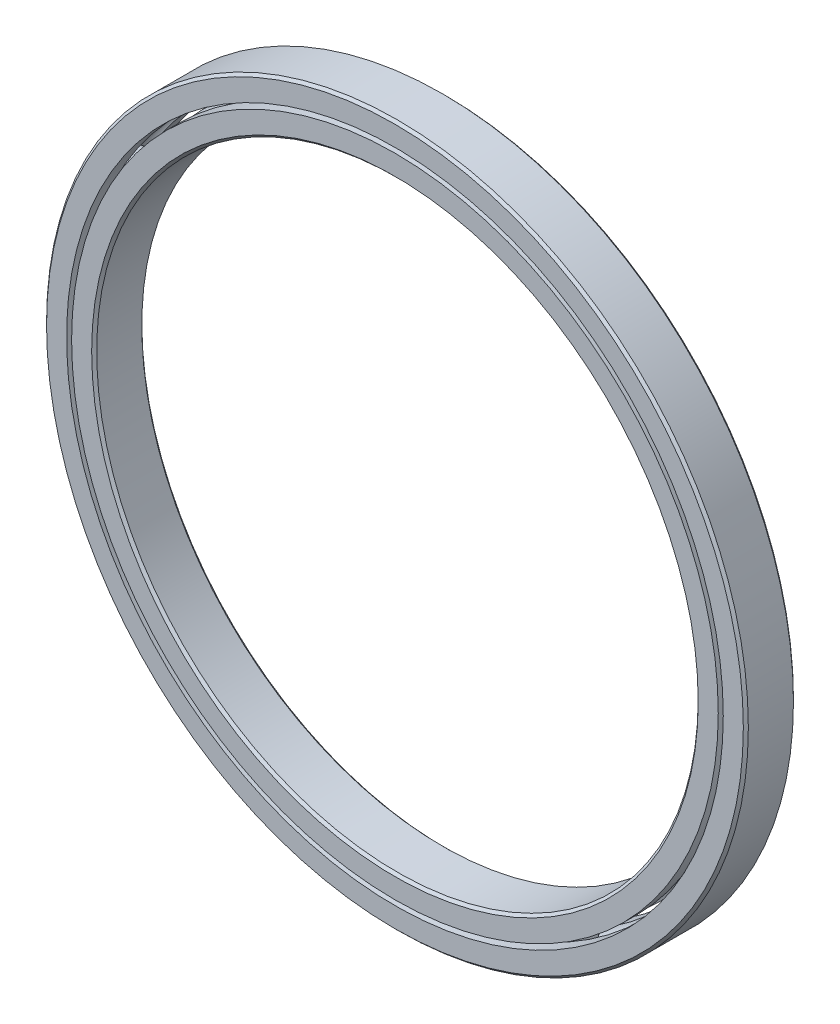
ISO-10303-21;
HEADER;
FILE_DESCRIPTION(('STEP AP214'),'2;1');
FILE_NAME('part.step','',(''),(''),'','','');
FILE_SCHEMA(('AUTOMOTIVE_DESIGN { 1 0 10303 214 1 1 1 1 }'));
ENDSEC;
DATA;
#1=APPLICATION_CONTEXT('core data for automotive mechanical design processes');
#2=APPLICATION_PROTOCOL_DEFINITION('international standard','automotive_design',2000,#1);
#3=PRODUCT_CONTEXT('',#1,'mechanical');
#4=PRODUCT('Part','Part','',(#3));
#5=PRODUCT_RELATED_PRODUCT_CATEGORY('part','',(#4));
#6=PRODUCT_DEFINITION_FORMATION('','',#4);
#7=PRODUCT_DEFINITION_CONTEXT('part definition',#1,'design');
#8=PRODUCT_DEFINITION('design','',#6,#7);
#9=PRODUCT_DEFINITION_SHAPE('','',#8);
#10=(LENGTH_UNIT() NAMED_UNIT(*) SI_UNIT(.MILLI.,.METRE.));
#11=(NAMED_UNIT(*) PLANE_ANGLE_UNIT() SI_UNIT($,.RADIAN.));
#12=(NAMED_UNIT(*) SI_UNIT($,.STERADIAN.) SOLID_ANGLE_UNIT());
#13=UNCERTAINTY_MEASURE_WITH_UNIT(LENGTH_MEASURE(1.E-05),#10,'distance_accuracy_value','');
#14=(GEOMETRIC_REPRESENTATION_CONTEXT(3) GLOBAL_UNCERTAINTY_ASSIGNED_CONTEXT((#13)) GLOBAL_UNIT_ASSIGNED_CONTEXT((#10,
#11,#12)) REPRESENTATION_CONTEXT('',''));
#15=CARTESIAN_POINT('',(0.,0.,0.));
#16=DIRECTION('',(0.,0.,1.));
#17=DIRECTION('',(1.,0.,0.));
#18=AXIS2_PLACEMENT_3D('',#15,#16,#17);
#19=CARTESIAN_POINT('',(-20.6374999999995,35.745198541203,0.));
#20=DIRECTION('',(0.,0.,1.));
#21=DIRECTION('',(-0.499999999999989,0.866025403784445,0.));
#22=AXIS2_PLACEMENT_3D('',#19,#20,#21);
#23=SPHERICAL_SURFACE('',#22,1.44638888888889);
#24=CARTESIAN_POINT('',(-20.6374999999995,35.745198541203,1.44638888888889));
#25=VERTEX_POINT('',#24);
#26=VERTEX_LOOP('',#25);
#27=FACE_BOUND('',#26,.T.);
#28=ADVANCED_FACE('F37',(#27),#23,.T.);
#29=CLOSED_SHELL('',(#28));
#30=MANIFOLD_SOLID_BREP('B2',#29);
#31=CARTESIAN_POINT('',(-35.7451985412025,20.6375000000004,0.));
#32=DIRECTION('',(0.,0.,1.));
#33=DIRECTION('',(-0.866025403784433,0.50000000000001,0.));
#34=AXIS2_PLACEMENT_3D('',#31,#32,#33);
#35=SPHERICAL_SURFACE('',#34,1.44638888888889);
#36=CARTESIAN_POINT('',(-35.7451985412025,20.6375000000004,1.44638888888889));
#37=VERTEX_POINT('',#36);
#38=VERTEX_LOOP('',#37);
#39=FACE_BOUND('',#38,.T.);
#40=ADVANCED_FACE('F57',(#39),#35,.T.);
#41=CLOSED_SHELL('',(#40));
#42=MANIFOLD_SOLID_BREP('B6',#41);
#43=CARTESIAN_POINT('',(-41.275,4.32332676782251E-13,0.));
#44=DIRECTION('',(0.,0.,1.));
#45=DIRECTION('',(-1.,0.,0.));
#46=AXIS2_PLACEMENT_3D('',#43,#44,#45);
#47=SPHERICAL_SURFACE('',#46,1.44638888888889);
#48=CARTESIAN_POINT('',(-41.275,4.32332676782251E-13,1.44638888888889));
#49=VERTEX_POINT('',#48);
#50=VERTEX_LOOP('',#49);
#51=FACE_BOUND('',#50,.T.);
#52=ADVANCED_FACE('F77',(#51),#47,.T.);
#53=CLOSED_SHELL('',(#52));
#54=MANIFOLD_SOLID_BREP('B33',#53);
#55=CARTESIAN_POINT('',(-35.7451985412029,-20.6374999999997,0.));
#56=DIRECTION('',(0.,0.,1.));
#57=DIRECTION('',(-0.866025403784443,-0.499999999999992,0.));
#58=AXIS2_PLACEMENT_3D('',#55,#56,#57);
#59=SPHERICAL_SURFACE('',#58,1.44638888888889);
#60=CARTESIAN_POINT('',(-35.7451985412029,-20.6374999999997,1.44638888888889));
#61=VERTEX_POINT('',#60);
#62=VERTEX_LOOP('',#61);
#63=FACE_BOUND('',#62,.T.);
#64=ADVANCED_FACE('F97',(#63),#59,.T.);
#65=CLOSED_SHELL('',(#64));
#66=MANIFOLD_SOLID_BREP('B53',#65);
#67=CARTESIAN_POINT('',(-20.6375000000003,-35.7451985412025,0.));
#68=DIRECTION('',(0.,0.,1.));
#69=DIRECTION('',(-0.500000000000007,-0.866025403784435,0.));
#70=AXIS2_PLACEMENT_3D('',#67,#68,#69);
#71=SPHERICAL_SURFACE('',#70,1.44638888888889);
#72=CARTESIAN_POINT('',(-20.6375000000003,-35.7451985412025,1.44638888888889));
#73=VERTEX_POINT('',#72);
#74=VERTEX_LOOP('',#73);
#75=FACE_BOUND('',#74,.T.);
#76=ADVANCED_FACE('F117',(#75),#71,.T.);
#77=CLOSED_SHELL('',(#76));
#78=MANIFOLD_SOLID_BREP('B73',#77);
#79=CARTESIAN_POINT('',(-2.88221784521501E-13,-41.275,0.));
#80=DIRECTION('',(0.,0.,1.));
#81=DIRECTION('',(0.,-1.,0.));
#82=AXIS2_PLACEMENT_3D('',#79,#80,#81);
#83=SPHERICAL_SURFACE('',#82,1.44638888888889);
#84=CARTESIAN_POINT('',(-2.88221784521501E-13,-41.275,1.44638888888889));
#85=VERTEX_POINT('',#84);
#86=VERTEX_LOOP('',#85);
#87=FACE_BOUND('',#86,.T.);
#88=ADVANCED_FACE('F137',(#87),#83,.T.);
#89=CLOSED_SHELL('',(#88));
#90=MANIFOLD_SOLID_BREP('B93',#89);
#91=CARTESIAN_POINT('',(20.6374999999998,-35.7451985412028,0.));
#92=DIRECTION('',(0.,0.,1.));
#93=DIRECTION('',(0.499999999999995,-0.866025403784442,0.));
#94=AXIS2_PLACEMENT_3D('',#91,#92,#93);
#95=SPHERICAL_SURFACE('',#94,1.44638888888889);
#96=CARTESIAN_POINT('',(20.6374999999998,-35.7451985412028,1.44638888888889));
#97=VERTEX_POINT('',#96);
#98=VERTEX_LOOP('',#97);
#99=FACE_BOUND('',#98,.T.);
#100=ADVANCED_FACE('F157',(#99),#95,.T.);
#101=CLOSED_SHELL('',(#100));
#102=MANIFOLD_SOLID_BREP('B113',#101);
#103=CARTESIAN_POINT('',(35.7451985412026,-20.6375000000002,0.));
#104=DIRECTION('',(0.,0.,1.));
#105=DIRECTION('',(0.866025403784436,-0.500000000000004,0.));
#106=AXIS2_PLACEMENT_3D('',#103,#104,#105);
#107=SPHERICAL_SURFACE('',#106,1.44638888888889);
#108=CARTESIAN_POINT('',(35.7451985412026,-20.6375000000002,1.44638888888889));
#109=VERTEX_POINT('',#108);
#110=VERTEX_LOOP('',#109);
#111=FACE_BOUND('',#110,.T.);
#112=ADVANCED_FACE('F177',(#111),#107,.T.);
#113=CLOSED_SHELL('',(#112));
#114=MANIFOLD_SOLID_BREP('B133',#113);
#115=CARTESIAN_POINT('',(41.275,-1.4411089226075E-13,0.));
#116=DIRECTION('',(0.,0.,1.));
#117=DIRECTION('',(1.,0.,0.));
#118=AXIS2_PLACEMENT_3D('',#115,#116,#117);
#119=SPHERICAL_SURFACE('',#118,1.44638888888889);
#120=CARTESIAN_POINT('',(41.275,-1.4411089226075E-13,1.44638888888889));
#121=VERTEX_POINT('',#120);
#122=VERTEX_LOOP('',#121);
#123=FACE_BOUND('',#122,.T.);
#124=ADVANCED_FACE('F197',(#123),#119,.T.);
#125=CLOSED_SHELL('',(#124));
#126=MANIFOLD_SOLID_BREP('B153',#125);
#127=CARTESIAN_POINT('',(35.7451985412028,20.6374999999999,0.));
#128=DIRECTION('',(0.,0.,1.));
#129=DIRECTION('',(0.86602540378444,0.499999999999998,0.));
#130=AXIS2_PLACEMENT_3D('',#127,#128,#129);
#131=SPHERICAL_SURFACE('',#130,1.44638888888889);
#132=CARTESIAN_POINT('',(35.7451985412028,20.6374999999999,1.44638888888889));
#133=VERTEX_POINT('',#132);
#134=VERTEX_LOOP('',#133);
#135=FACE_BOUND('',#134,.T.);
#136=ADVANCED_FACE('F217',(#135),#131,.T.);
#137=CLOSED_SHELL('',(#136));
#138=MANIFOLD_SOLID_BREP('B173',#137);
#139=CARTESIAN_POINT('',(20.6375,35.7451985412027,0.));
#140=DIRECTION('',(0.,0.,1.));
#141=DIRECTION('',(0.500000000000001,0.866025403784438,0.));
#142=AXIS2_PLACEMENT_3D('',#139,#140,#141);
#143=SPHERICAL_SURFACE('',#142,1.44638888888889);
#144=CARTESIAN_POINT('',(20.6375,35.7451985412027,1.44638888888889));
#145=VERTEX_POINT('',#144);
#146=VERTEX_LOOP('',#145);
#147=FACE_BOUND('',#146,.T.);
#148=ADVANCED_FACE('F237',(#147),#143,.T.);
#149=CLOSED_SHELL('',(#148));
#150=MANIFOLD_SOLID_BREP('B193',#149);
#151=CARTESIAN_POINT('',(0.,41.275,0.));
#152=DIRECTION('',(0.,0.,1.));
#153=DIRECTION('',(0.,1.,0.));
#154=AXIS2_PLACEMENT_3D('',#151,#152,#153);
#155=SPHERICAL_SURFACE('',#154,1.44638888888889);
#156=CARTESIAN_POINT('',(0.,41.275,1.44638888888889));
#157=VERTEX_POINT('',#156);
#158=VERTEX_LOOP('',#157);
#159=FACE_BOUND('',#158,.T.);
#160=ADVANCED_FACE('F259',(#159),#155,.T.);
#161=CLOSED_SHELL('',(#160));
#162=MANIFOLD_SOLID_BREP('B213',#161);
#163=CARTESIAN_POINT('',(0.,40.9575,3.17500000000001));
#164=DIRECTION('',(0.,0.,-1.));
#165=DIRECTION('',(-1.,0.,0.));
#166=AXIS2_PLACEMENT_3D('',#163,#164,#165);
#167=PLANE('',#166);
#168=CARTESIAN_POINT('',(0.,0.,3.17500000000001));
#169=DIRECTION('',(0.,0.,1.));
#170=DIRECTION('',(1.,0.,0.));
#171=AXIS2_PLACEMENT_3D('',#168,#169,#170);
#172=CIRCLE('',#171,38.4175);
#173=CARTESIAN_POINT('',(38.4175,0.,3.17500000000001));
#174=VERTEX_POINT('',#173);
#175=EDGE_CURVE('E306',#174,#174,#172,.T.);
#176=ORIENTED_EDGE('',*,*,#175,.F.);
#177=EDGE_LOOP('',(#176));
#178=FACE_BOUND('',#177,.T.);
#179=CARTESIAN_POINT('',(0.,0.,3.17500000000001));
#180=DIRECTION('',(0.,0.,1.));
#181=DIRECTION('',(1.,0.,0.));
#182=AXIS2_PLACEMENT_3D('',#179,#180,#181);
#183=CIRCLE('',#182,40.9575);
#184=CARTESIAN_POINT('',(40.9575,0.,3.17500000000001));
#185=VERTEX_POINT('',#184);
#186=EDGE_CURVE('E258',#185,#185,#183,.T.);
#187=ORIENTED_EDGE('',*,*,#186,.T.);
#188=EDGE_LOOP('',(#187));
#189=FACE_BOUND('',#188,.T.);
#190=ADVANCED_FACE('F278',(#178,#189),#167,.F.);
#191=CARTESIAN_POINT('',(0.,0.,3.175));
#192=DIRECTION('',(0.,0.,1.));
#193=DIRECTION('',(1.,0.,0.));
#194=AXIS2_PLACEMENT_3D('',#191,#192,#193);
#195=CYLINDRICAL_SURFACE('',#194,40.9575);
#196=ORIENTED_EDGE('',*,*,#186,.F.);
#197=EDGE_LOOP('',(#196));
#198=FACE_BOUND('',#197,.T.);
#199=CARTESIAN_POINT('',(0.,0.,1.41111111111111));
#200=DIRECTION('',(0.,0.,1.));
#201=DIRECTION('',(1.,0.,0.));
#202=AXIS2_PLACEMENT_3D('',#199,#200,#201);
#203=CIRCLE('',#202,40.9575);
#204=CARTESIAN_POINT('',(40.9575,0.,1.41111111111111));
#205=VERTEX_POINT('',#204);
#206=EDGE_CURVE('E284',#205,#205,#203,.T.);
#207=ORIENTED_EDGE('',*,*,#206,.T.);
#208=EDGE_LOOP('',(#207));
#209=FACE_BOUND('',#208,.T.);
#210=ADVANCED_FACE('F313',(#198,#209),#195,.T.);
#211=CARTESIAN_POINT('',(0.,0.,0.));
#212=DIRECTION('',(0.,0.,1.));
#213=DIRECTION('',(1.,0.,0.));
#214=AXIS2_PLACEMENT_3D('',#211,#212,#213);
#215=TOROIDAL_SURFACE('',#214,41.275,1.44638888888888);
#216=ORIENTED_EDGE('',*,*,#206,.F.);
#217=EDGE_LOOP('',(#216));
#218=FACE_BOUND('',#217,.T.);
#219=CARTESIAN_POINT('',(0.,0.,-1.41111111111112));
#220=DIRECTION('',(0.,0.,1.));
#221=DIRECTION('',(1.,0.,0.));
#222=AXIS2_PLACEMENT_3D('',#219,#220,#221);
#223=CIRCLE('',#222,40.9575);
#224=CARTESIAN_POINT('',(40.9575,0.,-1.41111111111112));
#225=VERTEX_POINT('',#224);
#226=EDGE_CURVE('E288',#225,#225,#223,.T.);
#227=ORIENTED_EDGE('',*,*,#226,.T.);
#228=EDGE_LOOP('',(#227));
#229=FACE_BOUND('',#228,.T.);
#230=ADVANCED_FACE('F317',(#218,#229),#215,.F.);
#231=CARTESIAN_POINT('',(0.,0.,3.175));
#232=DIRECTION('',(0.,0.,1.));
#233=DIRECTION('',(1.,0.,0.));
#234=AXIS2_PLACEMENT_3D('',#231,#232,#233);
#235=CYLINDRICAL_SURFACE('',#234,40.9575);
#236=ORIENTED_EDGE('',*,*,#226,.F.);
#237=EDGE_LOOP('',(#236));
#238=FACE_BOUND('',#237,.T.);
#239=CARTESIAN_POINT('',(0.,0.,-3.17500000000001));
#240=DIRECTION('',(0.,0.,1.));
#241=DIRECTION('',(1.,0.,0.));
#242=AXIS2_PLACEMENT_3D('',#239,#240,#241);
#243=CIRCLE('',#242,40.9575);
#244=CARTESIAN_POINT('',(40.9575,0.,-3.17500000000001));
#245=VERTEX_POINT('',#244);
#246=EDGE_CURVE('E292',#245,#245,#243,.T.);
#247=ORIENTED_EDGE('',*,*,#246,.T.);
#248=EDGE_LOOP('',(#247));
#249=FACE_BOUND('',#248,.T.);
#250=ADVANCED_FACE('F322',(#238,#249),#235,.T.);
#251=CARTESIAN_POINT('',(0.,38.4175,-3.17500000000001));
#252=DIRECTION('',(0.,0.,1.));
#253=DIRECTION('',(1.,0.,0.));
#254=AXIS2_PLACEMENT_3D('',#251,#252,#253);
#255=PLANE('',#254);
#256=ORIENTED_EDGE('',*,*,#246,.F.);
#257=EDGE_LOOP('',(#256));
#258=FACE_BOUND('',#257,.T.);
#259=CARTESIAN_POINT('',(0.,0.,-3.17500000000001));
#260=DIRECTION('',(0.,0.,1.));
#261=DIRECTION('',(1.,0.,0.));
#262=AXIS2_PLACEMENT_3D('',#259,#260,#261);
#263=CIRCLE('',#262,38.4175);
#264=CARTESIAN_POINT('',(38.4175,0.,-3.17500000000001));
#265=VERTEX_POINT('',#264);
#266=EDGE_CURVE('E297',#265,#265,#263,.T.);
#267=ORIENTED_EDGE('',*,*,#266,.T.);
#268=EDGE_LOOP('',(#267));
#269=FACE_BOUND('',#268,.T.);
#270=ADVANCED_FACE('F328',(#258,#269),#255,.F.);
#271=CARTESIAN_POINT('',(0.,0.,-2.8575));
#272=DIRECTION('',(0.,0.,-1.));
#273=DIRECTION('',(-1.,0.,0.));
#274=AXIS2_PLACEMENT_3D('',#271,#272,#273);
#275=CONICAL_SURFACE('',#274,38.1,0.785398163397444);
#276=ORIENTED_EDGE('',*,*,#266,.F.);
#277=EDGE_LOOP('',(#276));
#278=FACE_BOUND('',#277,.T.);
#279=CARTESIAN_POINT('',(0.,0.,-2.8575));
#280=DIRECTION('',(0.,0.,1.));
#281=DIRECTION('',(1.,0.,0.));
#282=AXIS2_PLACEMENT_3D('',#279,#280,#281);
#283=CIRCLE('',#282,38.1);
#284=CARTESIAN_POINT('',(38.1,0.,-2.8575));
#285=VERTEX_POINT('',#284);
#286=EDGE_CURVE('E300',#285,#285,#283,.T.);
#287=ORIENTED_EDGE('',*,*,#286,.T.);
#288=EDGE_LOOP('',(#287));
#289=FACE_BOUND('',#288,.T.);
#290=ADVANCED_FACE('F332',(#278,#289),#275,.F.);
#291=CARTESIAN_POINT('',(0.,0.,3.175));
#292=DIRECTION('',(0.,0.,1.));
#293=DIRECTION('',(1.,0.,0.));
#294=AXIS2_PLACEMENT_3D('',#291,#292,#293);
#295=CYLINDRICAL_SURFACE('',#294,38.1);
#296=ORIENTED_EDGE('',*,*,#286,.F.);
#297=EDGE_LOOP('',(#296));
#298=FACE_BOUND('',#297,.T.);
#299=CARTESIAN_POINT('',(0.,0.,2.85750000000001));
#300=DIRECTION('',(0.,0.,1.));
#301=DIRECTION('',(1.,0.,0.));
#302=AXIS2_PLACEMENT_3D('',#299,#300,#301);
#303=CIRCLE('',#302,38.1);
#304=CARTESIAN_POINT('',(38.1,0.,2.85750000000001));
#305=VERTEX_POINT('',#304);
#306=EDGE_CURVE('E303',#305,#305,#303,.T.);
#307=ORIENTED_EDGE('',*,*,#306,.T.);
#308=EDGE_LOOP('',(#307));
#309=FACE_BOUND('',#308,.T.);
#310=ADVANCED_FACE('F336',(#298,#309),#295,.F.);
#311=CARTESIAN_POINT('',(0.,0.,3.17500000000001));
#312=DIRECTION('',(0.,0.,1.));
#313=DIRECTION('',(1.,0.,0.));
#314=AXIS2_PLACEMENT_3D('',#311,#312,#313);
#315=CONICAL_SURFACE('',#314,38.4175,0.78539816339746);
#316=ORIENTED_EDGE('',*,*,#306,.F.);
#317=EDGE_LOOP('',(#316));
#318=FACE_BOUND('',#317,.T.);
#319=ORIENTED_EDGE('',*,*,#175,.T.);
#320=EDGE_LOOP('',(#319));
#321=FACE_BOUND('',#320,.T.);
#322=ADVANCED_FACE('F310',(#318,#321),#315,.F.);
#323=CLOSED_SHELL('',(#190,#210,#230,#250,#270,#290,#310,#322));
#324=MANIFOLD_SOLID_BREP('B233',#323);
#325=CARTESIAN_POINT('',(0.,0.,2.8575));
#326=DIRECTION('',(0.,0.,-1.));
#327=DIRECTION('',(-1.,0.,0.));
#328=AXIS2_PLACEMENT_3D('',#325,#326,#327);
#329=CONICAL_SURFACE('',#328,44.45,0.785398163397446);
#330=CARTESIAN_POINT('',(0.,0.,3.17500000000001));
#331=DIRECTION('',(0.,0.,1.));
#332=DIRECTION('',(1.,0.,0.));
#333=AXIS2_PLACEMENT_3D('',#330,#331,#332);
#334=CIRCLE('',#333,44.1325);
#335=CARTESIAN_POINT('',(44.1325,0.,3.17500000000001));
#336=VERTEX_POINT('',#335);
#337=EDGE_CURVE('E427',#336,#336,#334,.T.);
#338=ORIENTED_EDGE('',*,*,#337,.F.);
#339=EDGE_LOOP('',(#338));
#340=FACE_BOUND('',#339,.T.);
#341=CARTESIAN_POINT('',(0.,0.,2.8575));
#342=DIRECTION('',(0.,0.,1.));
#343=DIRECTION('',(1.,0.,0.));
#344=AXIS2_PLACEMENT_3D('',#341,#342,#343);
#345=CIRCLE('',#344,44.45);
#346=CARTESIAN_POINT('',(44.45,0.,2.8575));
#347=VERTEX_POINT('',#346);
#348=EDGE_CURVE('E277',#347,#347,#345,.T.);
#349=ORIENTED_EDGE('',*,*,#348,.T.);
#350=EDGE_LOOP('',(#349));
#351=FACE_BOUND('',#350,.T.);
#352=ADVANCED_FACE('F399',(#340,#351),#329,.T.);
#353=CARTESIAN_POINT('',(0.,0.,3.175));
#354=DIRECTION('',(0.,0.,1.));
#355=DIRECTION('',(1.,0.,0.));
#356=AXIS2_PLACEMENT_3D('',#353,#354,#355);
#357=CYLINDRICAL_SURFACE('',#356,44.45);
#358=ORIENTED_EDGE('',*,*,#348,.F.);
#359=EDGE_LOOP('',(#358));
#360=FACE_BOUND('',#359,.T.);
#361=CARTESIAN_POINT('',(0.,0.,-2.8575));
#362=DIRECTION('',(0.,0.,1.));
#363=DIRECTION('',(1.,0.,0.));
#364=AXIS2_PLACEMENT_3D('',#361,#362,#363);
#365=CIRCLE('',#364,44.45);
#366=CARTESIAN_POINT('',(44.45,0.,-2.8575));
#367=VERTEX_POINT('',#366);
#368=EDGE_CURVE('E405',#367,#367,#365,.T.);
#369=ORIENTED_EDGE('',*,*,#368,.T.);
#370=EDGE_LOOP('',(#369));
#371=FACE_BOUND('',#370,.T.);
#372=ADVANCED_FACE('F434',(#360,#371),#357,.T.);
#373=CARTESIAN_POINT('',(0.,0.,-3.17500000000001));
#374=DIRECTION('',(0.,0.,1.));
#375=DIRECTION('',(1.,0.,0.));
#376=AXIS2_PLACEMENT_3D('',#373,#374,#375);
#377=CONICAL_SURFACE('',#376,44.1325,0.785398163397444);
#378=ORIENTED_EDGE('',*,*,#368,.F.);
#379=EDGE_LOOP('',(#378));
#380=FACE_BOUND('',#379,.T.);
#381=CARTESIAN_POINT('',(0.,0.,-3.17500000000001));
#382=DIRECTION('',(0.,0.,1.));
#383=DIRECTION('',(1.,0.,0.));
#384=AXIS2_PLACEMENT_3D('',#381,#382,#383);
#385=CIRCLE('',#384,44.1325);
#386=CARTESIAN_POINT('',(44.1325,0.,-3.17500000000001));
#387=VERTEX_POINT('',#386);
#388=EDGE_CURVE('E409',#387,#387,#385,.T.);
#389=ORIENTED_EDGE('',*,*,#388,.T.);
#390=EDGE_LOOP('',(#389));
#391=FACE_BOUND('',#390,.T.);
#392=ADVANCED_FACE('F438',(#380,#391),#377,.T.);
#393=CARTESIAN_POINT('',(0.,44.1325,-3.17500000000001));
#394=DIRECTION('',(0.,0.,1.));
#395=DIRECTION('',(1.,0.,0.));
#396=AXIS2_PLACEMENT_3D('',#393,#394,#395);
#397=PLANE('',#396);
#398=ORIENTED_EDGE('',*,*,#388,.F.);
#399=EDGE_LOOP('',(#398));
#400=FACE_BOUND('',#399,.T.);
#401=CARTESIAN_POINT('',(0.,0.,-3.17500000000001));
#402=DIRECTION('',(0.,0.,1.));
#403=DIRECTION('',(1.,0.,0.));
#404=AXIS2_PLACEMENT_3D('',#401,#402,#403);
#405=CIRCLE('',#404,41.5925);
#406=CARTESIAN_POINT('',(41.5925,0.,-3.17500000000001));
#407=VERTEX_POINT('',#406);
#408=EDGE_CURVE('E413',#407,#407,#405,.T.);
#409=ORIENTED_EDGE('',*,*,#408,.T.);
#410=EDGE_LOOP('',(#409));
#411=FACE_BOUND('',#410,.T.);
#412=ADVANCED_FACE('F443',(#400,#411),#397,.F.);
#413=CARTESIAN_POINT('',(0.,0.,3.175));
#414=DIRECTION('',(0.,0.,1.));
#415=DIRECTION('',(1.,0.,0.));
#416=AXIS2_PLACEMENT_3D('',#413,#414,#415);
#417=CYLINDRICAL_SURFACE('',#416,41.5925);
#418=ORIENTED_EDGE('',*,*,#408,.F.);
#419=EDGE_LOOP('',(#418));
#420=FACE_BOUND('',#419,.T.);
#421=CARTESIAN_POINT('',(0.,0.,-1.41111111111111));
#422=DIRECTION('',(0.,0.,1.));
#423=DIRECTION('',(1.,0.,0.));
#424=AXIS2_PLACEMENT_3D('',#421,#422,#423);
#425=CIRCLE('',#424,41.5925);
#426=CARTESIAN_POINT('',(41.5925,0.,-1.41111111111111));
#427=VERTEX_POINT('',#426);
#428=EDGE_CURVE('E418',#427,#427,#425,.T.);
#429=ORIENTED_EDGE('',*,*,#428,.T.);
#430=EDGE_LOOP('',(#429));
#431=FACE_BOUND('',#430,.T.);
#432=ADVANCED_FACE('F449',(#420,#431),#417,.F.);
#433=CARTESIAN_POINT('',(0.,0.,0.));
#434=DIRECTION('',(0.,0.,1.));
#435=DIRECTION('',(1.,0.,0.));
#436=AXIS2_PLACEMENT_3D('',#433,#434,#435);
#437=TOROIDAL_SURFACE('',#436,41.275,1.44638888888889);
#438=ORIENTED_EDGE('',*,*,#428,.F.);
#439=EDGE_LOOP('',(#438));
#440=FACE_BOUND('',#439,.T.);
#441=CARTESIAN_POINT('',(0.,0.,1.41111111111111));
#442=DIRECTION('',(0.,0.,1.));
#443=DIRECTION('',(1.,0.,0.));
#444=AXIS2_PLACEMENT_3D('',#441,#442,#443);
#445=CIRCLE('',#444,41.5925);
#446=CARTESIAN_POINT('',(41.5925,0.,1.41111111111111));
#447=VERTEX_POINT('',#446);
#448=EDGE_CURVE('E421',#447,#447,#445,.T.);
#449=ORIENTED_EDGE('',*,*,#448,.T.);
#450=EDGE_LOOP('',(#449));
#451=FACE_BOUND('',#450,.T.);
#452=ADVANCED_FACE('F453',(#440,#451),#437,.F.);
#453=CARTESIAN_POINT('',(0.,0.,3.175));
#454=DIRECTION('',(0.,0.,1.));
#455=DIRECTION('',(1.,0.,0.));
#456=AXIS2_PLACEMENT_3D('',#453,#454,#455);
#457=CYLINDRICAL_SURFACE('',#456,41.5925);
#458=ORIENTED_EDGE('',*,*,#448,.F.);
#459=EDGE_LOOP('',(#458));
#460=FACE_BOUND('',#459,.T.);
#461=CARTESIAN_POINT('',(0.,0.,3.175));
#462=DIRECTION('',(0.,0.,1.));
#463=DIRECTION('',(1.,0.,0.));
#464=AXIS2_PLACEMENT_3D('',#461,#462,#463);
#465=CIRCLE('',#464,41.5925);
#466=CARTESIAN_POINT('',(41.5925,0.,3.175));
#467=VERTEX_POINT('',#466);
#468=EDGE_CURVE('E424',#467,#467,#465,.T.);
#469=ORIENTED_EDGE('',*,*,#468,.T.);
#470=EDGE_LOOP('',(#469));
#471=FACE_BOUND('',#470,.T.);
#472=ADVANCED_FACE('F457',(#460,#471),#457,.F.);
#473=CARTESIAN_POINT('',(0.,44.1325,3.17500000000001));
#474=DIRECTION('',(0.,0.,-1.));
#475=DIRECTION('',(-1.,0.,0.));
#476=AXIS2_PLACEMENT_3D('',#473,#474,#475);
#477=PLANE('',#476);
#478=ORIENTED_EDGE('',*,*,#468,.F.);
#479=EDGE_LOOP('',(#478));
#480=FACE_BOUND('',#479,.T.);
#481=ORIENTED_EDGE('',*,*,#337,.T.);
#482=EDGE_LOOP('',(#481));
#483=FACE_BOUND('',#482,.T.);
#484=ADVANCED_FACE('F431',(#480,#483),#477,.F.);
#485=CLOSED_SHELL('',(#352,#372,#392,#412,#432,#452,#472,#484));
#486=MANIFOLD_SOLID_BREP('B253',#485);
#487=ADVANCED_BREP_SHAPE_REPRESENTATION('',(#18,#30,#42,#54,#66,#78,#90,#102,#114,#126,#138,
#150,#162,#324,#486),#14);
#488=SHAPE_DEFINITION_REPRESENTATION(#9,#487);
ENDSEC;
END-ISO-10303-21;
